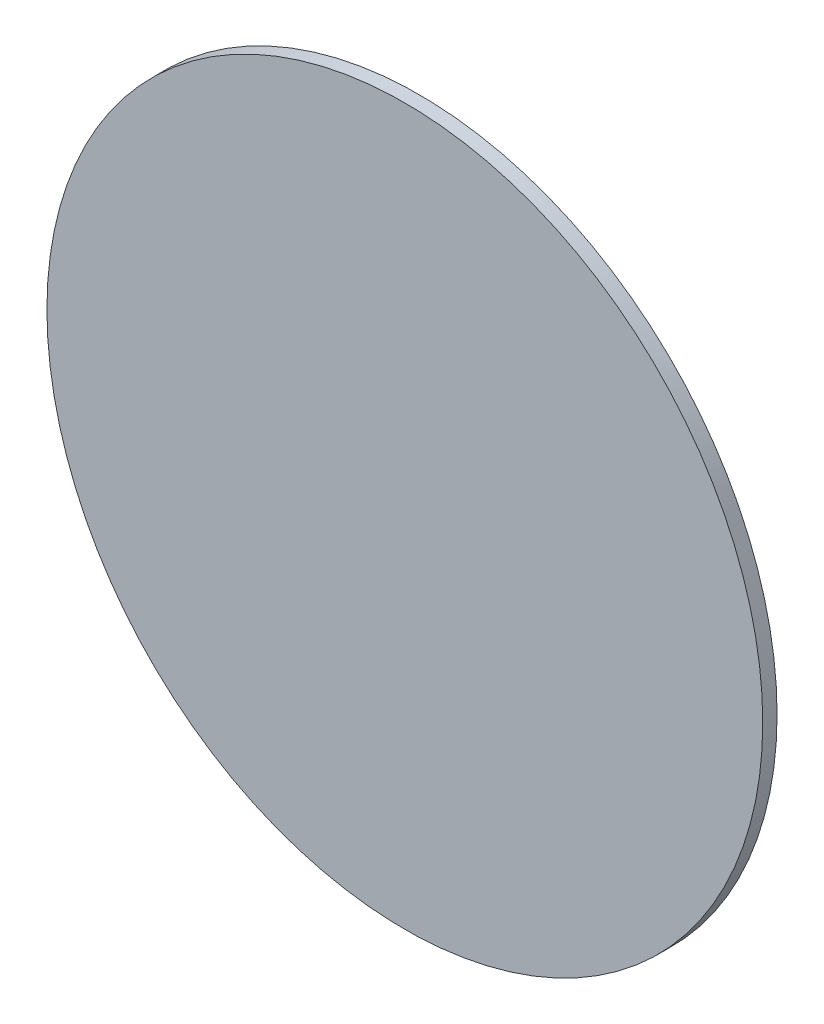
ISO-10303-21;
HEADER;
FILE_DESCRIPTION(('STEP AP214'),'2;1');
FILE_NAME('part.step','',(''),(''),'','','');
FILE_SCHEMA(('AUTOMOTIVE_DESIGN { 1 0 10303 214 1 1 1 1 }'));
ENDSEC;
DATA;
#1=APPLICATION_CONTEXT('core data for automotive mechanical design processes');
#2=APPLICATION_PROTOCOL_DEFINITION('international standard','automotive_design',2000,#1);
#3=PRODUCT_CONTEXT('',#1,'mechanical');
#4=PRODUCT('Part','Part','',(#3));
#5=PRODUCT_RELATED_PRODUCT_CATEGORY('part','',(#4));
#6=PRODUCT_DEFINITION_FORMATION('','',#4);
#7=PRODUCT_DEFINITION_CONTEXT('part definition',#1,'design');
#8=PRODUCT_DEFINITION('design','',#6,#7);
#9=PRODUCT_DEFINITION_SHAPE('','',#8);
#10=(LENGTH_UNIT() NAMED_UNIT(*) SI_UNIT(.MILLI.,.METRE.));
#11=(NAMED_UNIT(*) PLANE_ANGLE_UNIT() SI_UNIT($,.RADIAN.));
#12=(NAMED_UNIT(*) SI_UNIT($,.STERADIAN.) SOLID_ANGLE_UNIT());
#13=UNCERTAINTY_MEASURE_WITH_UNIT(LENGTH_MEASURE(1.E-05),#10,'distance_accuracy_value','');
#14=(GEOMETRIC_REPRESENTATION_CONTEXT(3) GLOBAL_UNCERTAINTY_ASSIGNED_CONTEXT((#13)) GLOBAL_UNIT_ASSIGNED_CONTEXT((#10,
#11,#12)) REPRESENTATION_CONTEXT('',''));
#15=CARTESIAN_POINT('',(0.,0.,0.));
#16=DIRECTION('',(0.,0.,1.));
#17=DIRECTION('',(1.,0.,0.));
#18=AXIS2_PLACEMENT_3D('',#15,#16,#17);
#19=CARTESIAN_POINT('',(0.,0.,2.54));
#20=DIRECTION('',(0.,0.,-1.));
#21=DIRECTION('',(-1.,0.,0.));
#22=AXIS2_PLACEMENT_3D('',#19,#20,#21);
#23=CYLINDRICAL_SURFACE('',#22,63.5);
#24=CARTESIAN_POINT('',(0.,0.,2.54));
#25=DIRECTION('',(0.,0.,1.));
#26=DIRECTION('',(1.,0.,0.));
#27=AXIS2_PLACEMENT_3D('',#24,#25,#26);
#28=CIRCLE('',#27,63.5);
#29=CARTESIAN_POINT('',(63.5,0.,2.54));
#30=VERTEX_POINT('',#29);
#31=EDGE_CURVE('E10',#30,#30,#28,.T.);
#32=ORIENTED_EDGE('',*,*,#31,.F.);
#33=EDGE_LOOP('',(#32));
#34=FACE_BOUND('',#33,.T.);
#35=CARTESIAN_POINT('',(0.,0.,0.));
#36=DIRECTION('',(0.,0.,1.));
#37=DIRECTION('',(1.,0.,0.));
#38=AXIS2_PLACEMENT_3D('',#35,#36,#37);
#39=CIRCLE('',#38,63.5);
#40=CARTESIAN_POINT('',(63.5,0.,0.));
#41=VERTEX_POINT('',#40);
#42=EDGE_CURVE('E37',#41,#41,#39,.T.);
#43=ORIENTED_EDGE('',*,*,#42,.T.);
#44=EDGE_LOOP('',(#43));
#45=FACE_BOUND('',#44,.T.);
#46=ADVANCED_FACE('F34',(#34,#45),#23,.T.);
#47=CARTESIAN_POINT('',(0.,0.,2.54));
#48=DIRECTION('',(0.,0.,1.));
#49=DIRECTION('',(1.,0.,0.));
#50=AXIS2_PLACEMENT_3D('',#47,#48,#49);
#51=PLANE('',#50);
#52=ORIENTED_EDGE('',*,*,#31,.T.);
#53=EDGE_LOOP('',(#52));
#54=FACE_BOUND('',#53,.T.);
#55=ADVANCED_FACE('F49',(#54),#51,.T.);
#56=CARTESIAN_POINT('',(0.,0.,0.));
#57=DIRECTION('',(0.,0.,1.));
#58=DIRECTION('',(1.,0.,0.));
#59=AXIS2_PLACEMENT_3D('',#56,#57,#58);
#60=PLANE('',#59);
#61=ORIENTED_EDGE('',*,*,#42,.F.);
#62=EDGE_LOOP('',(#61));
#63=FACE_BOUND('',#62,.T.);
#64=ADVANCED_FACE('F47',(#63),#60,.F.);
#65=CLOSED_SHELL('',(#46,#55,#64));
#66=MANIFOLD_SOLID_BREP('B2',#65);
#67=ADVANCED_BREP_SHAPE_REPRESENTATION('',(#18,#66),#14);
#68=SHAPE_DEFINITION_REPRESENTATION(#9,#67);
ENDSEC;
END-ISO-10303-21;
